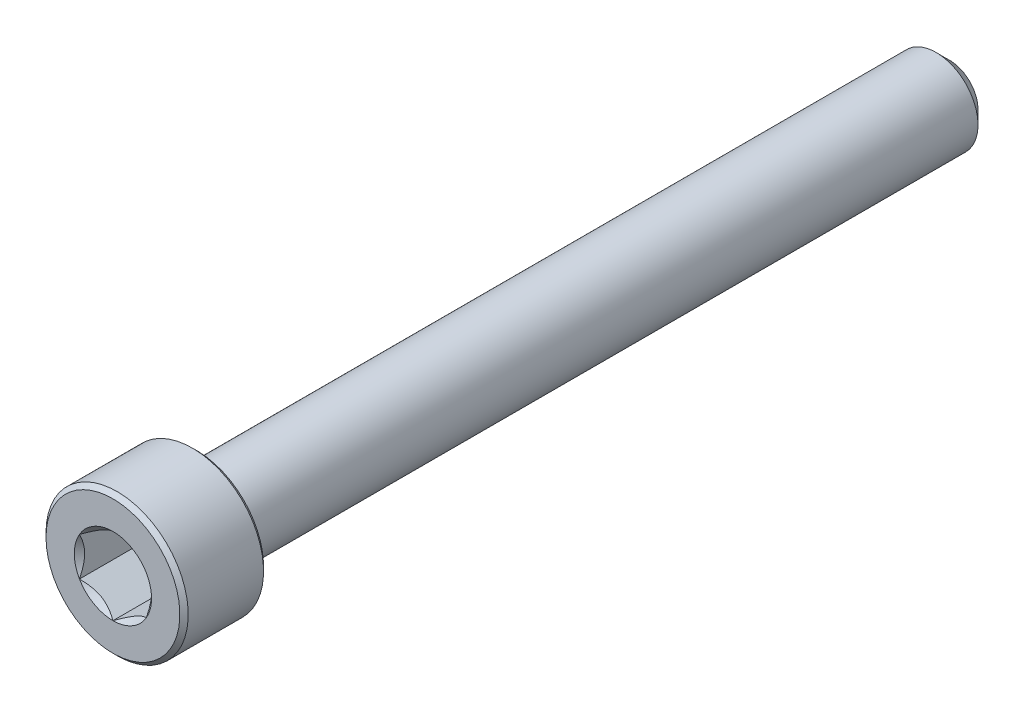
ISO-10303-21;
HEADER;
FILE_DESCRIPTION(('STEP AP214'),'2;1');
FILE_NAME('part.step','',(''),(''),'','','');
FILE_SCHEMA(('AUTOMOTIVE_DESIGN { 1 0 10303 214 1 1 1 1 }'));
ENDSEC;
DATA;
#1=APPLICATION_CONTEXT('core data for automotive mechanical design processes');
#2=APPLICATION_PROTOCOL_DEFINITION('international standard','automotive_design',2000,#1);
#3=PRODUCT_CONTEXT('',#1,'mechanical');
#4=PRODUCT('Part','Part','',(#3));
#5=PRODUCT_RELATED_PRODUCT_CATEGORY('part','',(#4));
#6=PRODUCT_DEFINITION_FORMATION('','',#4);
#7=PRODUCT_DEFINITION_CONTEXT('part definition',#1,'design');
#8=PRODUCT_DEFINITION('design','',#6,#7);
#9=PRODUCT_DEFINITION_SHAPE('','',#8);
#10=(LENGTH_UNIT() NAMED_UNIT(*) SI_UNIT(.MILLI.,.METRE.));
#11=(NAMED_UNIT(*) PLANE_ANGLE_UNIT() SI_UNIT($,.RADIAN.));
#12=(NAMED_UNIT(*) SI_UNIT($,.STERADIAN.) SOLID_ANGLE_UNIT());
#13=UNCERTAINTY_MEASURE_WITH_UNIT(LENGTH_MEASURE(1.E-05),#10,'distance_accuracy_value','');
#14=(GEOMETRIC_REPRESENTATION_CONTEXT(3) GLOBAL_UNCERTAINTY_ASSIGNED_CONTEXT((#13)) GLOBAL_UNIT_ASSIGNED_CONTEXT((#10,
#11,#12)) REPRESENTATION_CONTEXT('',''));
#15=CARTESIAN_POINT('',(0.,0.,0.));
#16=DIRECTION('',(0.,0.,1.));
#17=DIRECTION('',(1.,0.,0.));
#18=AXIS2_PLACEMENT_3D('',#15,#16,#17);
#19=CARTESIAN_POINT('',(0.,0.,25.));
#20=DIRECTION('',(0.,0.,1.));
#21=DIRECTION('',(1.,0.,0.));
#22=AXIS2_PLACEMENT_3D('',#19,#20,#21);
#23=PLANE('',#22);
#24=CARTESIAN_POINT('',(0.,0.,25.));
#25=DIRECTION('',(0.,0.,1.));
#26=DIRECTION('',(1.,0.,0.));
#27=AXIS2_PLACEMENT_3D('',#24,#25,#26);
#28=CIRCLE('',#27,2.3094010767585);
#29=CARTESIAN_POINT('',(2.,1.15470053837925,25.));
#30=VERTEX_POINT('',#29);
#31=CARTESIAN_POINT('',(0.,2.3094010767585,25.));
#32=VERTEX_POINT('',#31);
#33=EDGE_CURVE('E104',#30,#32,#28,.T.);
#34=ORIENTED_EDGE('',*,*,#33,.F.);
#35=CARTESIAN_POINT('',(2.,-1.15470053837925,25.));
#36=VERTEX_POINT('',#35);
#37=EDGE_CURVE('E95',#36,#30,#28,.T.);
#38=ORIENTED_EDGE('',*,*,#37,.F.);
#39=CARTESIAN_POINT('',(0.,-2.3094010767585,25.));
#40=VERTEX_POINT('',#39);
#41=EDGE_CURVE('E102',#40,#36,#28,.T.);
#42=ORIENTED_EDGE('',*,*,#41,.F.);
#43=CARTESIAN_POINT('',(-2.,-1.15470053837925,25.));
#44=VERTEX_POINT('',#43);
#45=EDGE_CURVE('E271',#44,#40,#28,.T.);
#46=ORIENTED_EDGE('',*,*,#45,.F.);
#47=CARTESIAN_POINT('',(-2.,1.15470053837925,25.));
#48=VERTEX_POINT('',#47);
#49=EDGE_CURVE('E131',#48,#44,#28,.T.);
#50=ORIENTED_EDGE('',*,*,#49,.F.);
#51=EDGE_CURVE('E126',#32,#48,#28,.T.);
#52=ORIENTED_EDGE('',*,*,#51,.F.);
#53=EDGE_LOOP('',(#34,#38,#42,#46,#50,#52));
#54=FACE_BOUND('',#53,.T.);
#55=CARTESIAN_POINT('',(0.,0.,25.));
#56=DIRECTION('',(0.,0.,-1.));
#57=DIRECTION('',(-1.,0.,0.));
#58=AXIS2_PLACEMENT_3D('',#55,#56,#57);
#59=CIRCLE('',#58,4.);
#60=CARTESIAN_POINT('',(-4.,0.,25.));
#61=VERTEX_POINT('',#60);
#62=EDGE_CURVE('E50',#61,#61,#59,.T.);
#63=ORIENTED_EDGE('',*,*,#62,.F.);
#64=EDGE_LOOP('',(#63));
#65=FACE_BOUND('',#64,.T.);
#66=ADVANCED_FACE('F37',(#54,#65),#23,.T.);
#67=CARTESIAN_POINT('',(0.,0.,24.75));
#68=DIRECTION('',(0.,0.,-1.));
#69=DIRECTION('',(-1.,0.,0.));
#70=AXIS2_PLACEMENT_3D('',#67,#68,#69);
#71=CONICAL_SURFACE('',#70,4.25,0.785398163397462);
#72=ORIENTED_EDGE('',*,*,#62,.T.);
#73=EDGE_LOOP('',(#72));
#74=FACE_BOUND('',#73,.T.);
#75=CARTESIAN_POINT('',(0.,0.,24.75));
#76=DIRECTION('',(0.,0.,-1.));
#77=DIRECTION('',(-1.,0.,0.));
#78=AXIS2_PLACEMENT_3D('',#75,#76,#77);
#79=CIRCLE('',#78,4.25);
#80=CARTESIAN_POINT('',(-4.25,0.,24.75));
#81=VERTEX_POINT('',#80);
#82=EDGE_CURVE('E217',#81,#81,#79,.T.);
#83=ORIENTED_EDGE('',*,*,#82,.F.);
#84=EDGE_LOOP('',(#83));
#85=FACE_BOUND('',#84,.T.);
#86=ADVANCED_FACE('F205',(#74,#85),#71,.T.);
#87=CARTESIAN_POINT('',(0.,0.,-25.));
#88=DIRECTION('',(0.,0.,-1.));
#89=DIRECTION('',(-1.,0.,0.));
#90=AXIS2_PLACEMENT_3D('',#87,#88,#89);
#91=CYLINDRICAL_SURFACE('',#90,4.25);
#92=ORIENTED_EDGE('',*,*,#82,.T.);
#93=EDGE_LOOP('',(#92));
#94=FACE_BOUND('',#93,.T.);
#95=CARTESIAN_POINT('',(0.,0.,20.25));
#96=DIRECTION('',(0.,0.,-1.));
#97=DIRECTION('',(-1.,0.,0.));
#98=AXIS2_PLACEMENT_3D('',#95,#96,#97);
#99=CIRCLE('',#98,4.25);
#100=CARTESIAN_POINT('',(-4.25,0.,20.25));
#101=VERTEX_POINT('',#100);
#102=EDGE_CURVE('E219',#101,#101,#99,.T.);
#103=ORIENTED_EDGE('',*,*,#102,.F.);
#104=EDGE_LOOP('',(#103));
#105=FACE_BOUND('',#104,.T.);
#106=ADVANCED_FACE('F202',(#94,#105),#91,.T.);
#107=CARTESIAN_POINT('',(0.,0.,20.));
#108=DIRECTION('',(0.,0.,1.));
#109=DIRECTION('',(1.,0.,0.));
#110=AXIS2_PLACEMENT_3D('',#107,#108,#109);
#111=CONICAL_SURFACE('',#110,4.,0.785398163397448);
#112=ORIENTED_EDGE('',*,*,#102,.T.);
#113=EDGE_LOOP('',(#112));
#114=FACE_BOUND('',#113,.T.);
#115=CARTESIAN_POINT('',(0.,0.,20.));
#116=DIRECTION('',(0.,0.,-1.));
#117=DIRECTION('',(-1.,0.,0.));
#118=AXIS2_PLACEMENT_3D('',#115,#116,#117);
#119=CIRCLE('',#118,4.);
#120=CARTESIAN_POINT('',(-4.,0.,20.));
#121=VERTEX_POINT('',#120);
#122=EDGE_CURVE('E225',#121,#121,#119,.T.);
#123=ORIENTED_EDGE('',*,*,#122,.F.);
#124=EDGE_LOOP('',(#123));
#125=FACE_BOUND('',#124,.T.);
#126=ADVANCED_FACE('F198',(#114,#125),#111,.T.);
#127=CARTESIAN_POINT('',(0.,4.,20.));
#128=DIRECTION('',(0.,0.,-1.));
#129=DIRECTION('',(-1.,0.,0.));
#130=AXIS2_PLACEMENT_3D('',#127,#128,#129);
#131=PLANE('',#130);
#132=ORIENTED_EDGE('',*,*,#122,.T.);
#133=EDGE_LOOP('',(#132));
#134=FACE_BOUND('',#133,.T.);
#135=CARTESIAN_POINT('',(0.,0.,20.));
#136=DIRECTION('',(0.,0.,-1.));
#137=DIRECTION('',(-1.,0.,0.));
#138=AXIS2_PLACEMENT_3D('',#135,#136,#137);
#139=CIRCLE('',#138,2.5);
#140=CARTESIAN_POINT('',(-2.5,0.,20.));
#141=VERTEX_POINT('',#140);
#142=EDGE_CURVE('E231',#141,#141,#139,.T.);
#143=ORIENTED_EDGE('',*,*,#142,.F.);
#144=EDGE_LOOP('',(#143));
#145=FACE_BOUND('',#144,.T.);
#146=ADVANCED_FACE('F194',(#134,#145),#131,.T.);
#147=CARTESIAN_POINT('',(0.,0.,-25.));
#148=DIRECTION('',(0.,0.,-1.));
#149=DIRECTION('',(-1.,0.,0.));
#150=AXIS2_PLACEMENT_3D('',#147,#148,#149);
#151=CYLINDRICAL_SURFACE('',#150,2.5);
#152=ORIENTED_EDGE('',*,*,#142,.T.);
#153=EDGE_LOOP('',(#152));
#154=FACE_BOUND('',#153,.T.);
#155=CARTESIAN_POINT('',(0.,0.,-24.2));
#156=DIRECTION('',(0.,0.,-1.));
#157=DIRECTION('',(-1.,0.,0.));
#158=AXIS2_PLACEMENT_3D('',#155,#156,#157);
#159=CIRCLE('',#158,2.5);
#160=CARTESIAN_POINT('',(-2.5,0.,-24.2));
#161=VERTEX_POINT('',#160);
#162=EDGE_CURVE('E234',#161,#161,#159,.T.);
#163=ORIENTED_EDGE('',*,*,#162,.F.);
#164=EDGE_LOOP('',(#163));
#165=FACE_BOUND('',#164,.T.);
#166=ADVANCED_FACE('F190',(#154,#165),#151,.T.);
#167=CARTESIAN_POINT('',(0.,0.,-25.));
#168=DIRECTION('',(0.,0.,1.));
#169=DIRECTION('',(1.,0.,0.));
#170=AXIS2_PLACEMENT_3D('',#167,#168,#169);
#171=CONICAL_SURFACE('',#170,1.7,0.78539816339744);
#172=ORIENTED_EDGE('',*,*,#162,.T.);
#173=EDGE_LOOP('',(#172));
#174=FACE_BOUND('',#173,.T.);
#175=CARTESIAN_POINT('',(0.,0.,-25.));
#176=DIRECTION('',(0.,0.,-1.));
#177=DIRECTION('',(-1.,0.,0.));
#178=AXIS2_PLACEMENT_3D('',#175,#176,#177);
#179=CIRCLE('',#178,1.7);
#180=CARTESIAN_POINT('',(-1.7,0.,-25.));
#181=VERTEX_POINT('',#180);
#182=EDGE_CURVE('E238',#181,#181,#179,.T.);
#183=ORIENTED_EDGE('',*,*,#182,.F.);
#184=EDGE_LOOP('',(#183));
#185=FACE_BOUND('',#184,.T.);
#186=ADVANCED_FACE('F186',(#174,#185),#171,.T.);
#187=CARTESIAN_POINT('',(0.,1.7,-25.));
#188=DIRECTION('',(0.,0.,-1.));
#189=DIRECTION('',(-1.,0.,0.));
#190=AXIS2_PLACEMENT_3D('',#187,#188,#189);
#191=PLANE('',#190);
#192=ORIENTED_EDGE('',*,*,#182,.T.);
#193=EDGE_LOOP('',(#192));
#194=FACE_BOUND('',#193,.T.);
#195=ADVANCED_FACE('F183',(#194),#191,.T.);
#196=CARTESIAN_POINT('',(0.,0.,25.));
#197=DIRECTION('',(0.,0.,1.));
#198=DIRECTION('',(1.,0.,0.));
#199=AXIS2_PLACEMENT_3D('',#196,#197,#198);
#200=CONICAL_SURFACE('',#199,2.3094010767585,0.78539816339745);
#201=ORIENTED_EDGE('',*,*,#41,.T.);
#202=CARTESIAN_POINT('',(-0.000199999999997986,-2.30951654681234,25.0001154787137));
#203=CARTESIAN_POINT('',(0.0685530340307071,-2.26982196410711,24.9604530902256));
#204=CARTESIAN_POINT('',(0.138455742135513,-2.22946361676572,24.9231199822842));
#205=CARTESIAN_POINT('',(0.280995244550438,-2.1471683966763,24.8547636851361));
#206=CARTESIAN_POINT('',(0.35364559756536,-2.10522369580642,24.8237785337372));
#207=CARTESIAN_POINT('',(0.500141601053972,-2.02064418875706,24.7707002165441));
#208=CARTESIAN_POINT('',(0.573949935246295,-1.97803092714269,24.7484736271766));
#209=CARTESIAN_POINT('',(0.723191631835264,-1.89186619344273,24.7142288166751));
#210=CARTESIAN_POINT('',(0.798620433918152,-1.84831735425552,24.7021850291441));
#211=CARTESIAN_POINT('',(0.928615500671079,-1.7732646674724,24.6913185119056));
#212=CARTESIAN_POINT('',(0.983013783970108,-1.74185780396625,24.68970975361));
#213=CARTESIAN_POINT('',(1.09172145551969,-1.67909540053412,24.6924188775987));
#214=CARTESIAN_POINT('',(1.14603080592134,-1.64773988246022,24.696738837758));
#215=CARTESIAN_POINT('',(1.25413672758934,-1.5853248994842,24.7110595674099));
#216=CARTESIAN_POINT('',(1.30793265655479,-1.55426580541469,24.721066692762));
#217=CARTESIAN_POINT('',(1.41459426230557,-1.49268469862228,24.7462124302497));
#218=CARTESIAN_POINT('',(1.46746001007071,-1.46216264491917,24.7613506490422));
#219=CARTESIAN_POINT('',(1.60287973308984,-1.38397803138049,24.8062945034292));
#220=CARTESIAN_POINT('',(1.68459383484948,-1.33680037273297,24.8394888394258));
#221=CARTESIAN_POINT('',(1.8047470372578,-1.26742988897853,24.8955258231714));
#222=CARTESIAN_POINT('',(1.84434285210918,-1.24456923461531,24.9152147029469));
#223=CARTESIAN_POINT('',(1.92280095888787,-1.19927142554652,24.9563873183649));
#224=CARTESIAN_POINT('',(1.96166368359374,-1.17683402097614,24.9778699516512));
#225=CARTESIAN_POINT('',(2.0002,-1.15458506832541,25.0001154787137));
#226=B_SPLINE_CURVE_WITH_KNOTS('',3,(#202,#203,#204,#205,#206,#207,#208,#209,#210,#211,#212,
#213,#214,#215,#216,#217,#218,#219,#220,#221,#222,#223,#224,#225),.UNSPECIFIED.,.F.,.F.,(4,2,2,
2,2,2,2,2,2,2,2,4),(0.,0.266420613771063,0.534393751523387,0.798110374376911,1.06116288956936,
1.24939906803721,1.43770123566247,1.62621426093931,1.81471283831913,2.11415604834144,
2.2634717071779,2.4126962696977),.UNSPECIFIED.);
#227=EDGE_CURVE('E12',#40,#36,#226,.T.);
#228=ORIENTED_EDGE('',*,*,#227,.F.);
#229=EDGE_LOOP('',(#201,#228));
#230=FACE_BOUND('',#229,.T.);
#231=ADVANCED_FACE('F149',(#230),#200,.F.);
#232=ORIENTED_EDGE('',*,*,#45,.T.);
#233=CARTESIAN_POINT('',(-2.0002,-1.15458506832541,25.0001154787137));
#234=CARTESIAN_POINT('',(-1.93144696596929,-1.19427965103064,24.9604530902256));
#235=CARTESIAN_POINT('',(-1.86154425786449,-1.23463799837204,24.9231199822842));
#236=CARTESIAN_POINT('',(-1.71900475544956,-1.31693321846145,24.8547636851361));
#237=CARTESIAN_POINT('',(-1.64635440243464,-1.35887791933134,24.8237785337372));
#238=CARTESIAN_POINT('',(-1.49985839894603,-1.44345742638069,24.7707002165441));
#239=CARTESIAN_POINT('',(-1.42605006475371,-1.48607068799507,24.7484736271766));
#240=CARTESIAN_POINT('',(-1.27680836816474,-1.57223542169503,24.7142288166751));
#241=CARTESIAN_POINT('',(-1.20137956608185,-1.61578426088223,24.7021850291441));
#242=CARTESIAN_POINT('',(-1.07138449932892,-1.69083694766536,24.6913185119056));
#243=CARTESIAN_POINT('',(-1.01698621602989,-1.72224381117151,24.68970975361));
#244=CARTESIAN_POINT('',(-0.908278544480307,-1.78500621460364,24.6924188775987));
#245=CARTESIAN_POINT('',(-0.853969194078661,-1.81636173267754,24.696738837758));
#246=CARTESIAN_POINT('',(-0.745863272410662,-1.87877671565355,24.7110595674099));
#247=CARTESIAN_POINT('',(-0.692067343445208,-1.90983580972306,24.721066692762));
#248=CARTESIAN_POINT('',(-0.585405737694427,-1.97141691651547,24.7462124302497));
#249=CARTESIAN_POINT('',(-0.532539989929288,-2.00193897021859,24.7613506490422));
#250=CARTESIAN_POINT('',(-0.397120266910156,-2.08012358375727,24.8062945034292));
#251=CARTESIAN_POINT('',(-0.315406165150521,-2.12730124240478,24.8394888394258));
#252=CARTESIAN_POINT('',(-0.195252962742198,-2.19667172615922,24.8955258231714));
#253=CARTESIAN_POINT('',(-0.155657147890823,-2.21953238052245,24.9152147029469));
#254=CARTESIAN_POINT('',(-0.0771990411121283,-2.26483018959123,24.9563873183649));
#255=CARTESIAN_POINT('',(-0.0383363164062601,-2.28726759416161,24.9778699516512));
#256=CARTESIAN_POINT('',(0.000200000000000165,-2.30951654681234,25.0001154787137));
#257=B_SPLINE_CURVE_WITH_KNOTS('',3,(#233,#234,#235,#236,#237,#238,#239,#240,#241,#242,#243,
#244,#245,#246,#247,#248,#249,#250,#251,#252,#253,#254,#255,#256),.UNSPECIFIED.,.F.,.F.,(4,2,2,
2,2,2,2,2,2,2,2,4),(0.,0.266420613771063,0.534393751523387,0.798110374376913,1.06116288956936,
1.24939906803721,1.43770123566247,1.62621426093931,1.81471283831913,2.11415604834145,
2.2634717071779,2.41269626969771),.UNSPECIFIED.);
#258=EDGE_CURVE('E127',#44,#40,#257,.T.);
#259=ORIENTED_EDGE('',*,*,#258,.F.);
#260=EDGE_LOOP('',(#232,#259));
#261=FACE_BOUND('',#260,.T.);
#262=ADVANCED_FACE('F279',(#261),#200,.F.);
#263=ORIENTED_EDGE('',*,*,#49,.T.);
#264=CARTESIAN_POINT('',(-2.,-2.30294417292923,25.7407713550277));
#265=CARTESIAN_POINT('',(-2.,-2.24687002663712,25.698443273626));
#266=CARTESIAN_POINT('',(-2.,-2.19048190536959,25.6565251568643));
#267=CARTESIAN_POINT('',(-2.,-2.07695390496424,25.573690417861));
#268=CARTESIAN_POINT('',(-2.,-2.01981384066454,25.5327740496681));
#269=CARTESIAN_POINT('',(-2.,-1.90424016804776,25.4518334520186));
#270=CARTESIAN_POINT('',(-2.,-1.8457999674391,25.4118185915599));
#271=CARTESIAN_POINT('',(-2.,-1.7279274546176,25.3332889936643));
#272=CARTESIAN_POINT('',(-2.,-1.66849521292324,25.2947741502431));
#273=CARTESIAN_POINT('',(-2.,-1.4816299571002,25.1776406516043));
#274=CARTESIAN_POINT('',(-2.,-1.35220318163536,25.1021459017296));
#275=CARTESIAN_POINT('',(-2.,-1.08689521592924,24.9640493509944));
#276=CARTESIAN_POINT('',(-2.,-0.951037763938192,24.9014040859035));
#277=CARTESIAN_POINT('',(-2.,-0.747111912259409,24.8247635438751));
#278=CARTESIAN_POINT('',(-2.,-0.682064034147876,24.8027671799191));
#279=CARTESIAN_POINT('',(-2.,-0.550398103294752,24.7639966876601));
#280=CARTESIAN_POINT('',(-2.,-0.483779942722476,24.7472229191212));
#281=CARTESIAN_POINT('',(-2.,-0.350484328847655,24.7200482578844));
#282=CARTESIAN_POINT('',(-2.,-0.283829489364786,24.7095381767417));
#283=CARTESIAN_POINT('',(-2.,-0.149806987139377,24.6950960855449));
#284=CARTESIAN_POINT('',(-2.,-0.0824394489341225,24.6911629447331));
#285=CARTESIAN_POINT('',(-2.,0.0499055622944887,24.6901664769337));
#286=CARTESIAN_POINT('',(-2.,0.114881285143171,24.6928596448504));
#287=CARTESIAN_POINT('',(-2.,0.244275921482759,24.7044300704227));
#288=CARTESIAN_POINT('',(-2.,0.308694780266752,24.7133079288332));
#289=CARTESIAN_POINT('',(-2.,0.437599788610703,24.7369136592961));
#290=CARTESIAN_POINT('',(-2.,0.502067428644594,24.7517410834465));
#291=CARTESIAN_POINT('',(-2.,0.629594322598305,24.786457883628));
#292=CARTESIAN_POINT('',(-2.,0.69265369388315,24.8063468361063));
#293=CARTESIAN_POINT('',(-2.,0.891187889210544,24.8764469792562));
#294=CARTESIAN_POINT('',(-2.,1.02383545707306,24.9346418003215));
#295=CARTESIAN_POINT('',(-2.,1.28290932150074,25.0640305754596));
#296=CARTESIAN_POINT('',(-2.,1.4093111258757,25.1352712314148));
#297=CARTESIAN_POINT('',(-2.,1.59200441438963,25.2464419918747));
#298=CARTESIAN_POINT('',(-2.,1.65027549026191,25.2831821903374));
#299=CARTESIAN_POINT('',(-2.,1.76581760389242,25.3582145141838));
#300=CARTESIAN_POINT('',(-2.,1.82308856543104,25.396506757118));
#301=CARTESIAN_POINT('',(-2.,1.93629654762084,25.4740422640812));
#302=CARTESIAN_POINT('',(-2.,1.99224062500538,25.5132752761336));
#303=CARTESIAN_POINT('',(-2.,2.10336424029899,25.5927788307365));
#304=CARTESIAN_POINT('',(-2.,2.15854398422468,25.6330490850006));
#305=CARTESIAN_POINT('',(-2.,2.21340370692658,25.6737442381459));
#306=B_SPLINE_CURVE_WITH_KNOTS('',3,(#264,#265,#266,#267,#268,#269,#270,#271,#272,#273,#274,
#275,#276,#277,#278,#279,#280,#281,#282,#283,#284,#285,#286,#287,#288,#289,#290,#291,#292,#293,
#294,#295,#296,#297,#298,#299,#300,#301,#302,#303,#304,#305),.UNSPECIFIED.,.F.,.F.,(4,2,2,2,2,2,
2,2,2,2,2,2,2,2,2,2,2,2,2,2,4),(0.,0.21077273197689,0.421598374658589,0.63405755462349,
0.846501695870171,1.29562155455624,1.74319622821645,1.94902062110207,2.15485918928325,
2.35699582502635,2.5590977043214,2.75388435553556,2.94868993014815,3.14690093452585,
3.34509535789702,3.77838155837654,4.21325029921625,4.41989056685646,4.62654651460921,
4.83152377111289,5.03644465914085),.UNSPECIFIED.);
#307=EDGE_CURVE('E129',#48,#44,#306,.F.);
#308=ORIENTED_EDGE('',*,*,#307,.F.);
#309=EDGE_LOOP('',(#263,#308));
#310=FACE_BOUND('',#309,.T.);
#311=ADVANCED_FACE('F276',(#310),#200,.F.);
#312=ORIENTED_EDGE('',*,*,#51,.T.);
#313=CARTESIAN_POINT('',(0.000199999999999413,2.30951654681234,25.0001154787137));
#314=CARTESIAN_POINT('',(-0.0685530340307058,2.26982196410711,24.9604530902256));
#315=CARTESIAN_POINT('',(-0.138455742135512,2.22946361676572,24.9231199822842));
#316=CARTESIAN_POINT('',(-0.280995244550438,2.1471683966763,24.8547636851361));
#317=CARTESIAN_POINT('',(-0.35364559756536,2.10522369580642,24.8237785337372));
#318=CARTESIAN_POINT('',(-0.500141601053973,2.02064418875706,24.7707002165441));
#319=CARTESIAN_POINT('',(-0.573949935246296,1.97803092714269,24.7484736271766));
#320=CARTESIAN_POINT('',(-0.723191631835266,1.89186619344273,24.7142288166751));
#321=CARTESIAN_POINT('',(-0.798620433918154,1.84831735425552,24.7021850291441));
#322=CARTESIAN_POINT('',(-0.928615500671081,1.77326466747239,24.6913185119056));
#323=CARTESIAN_POINT('',(-0.98301378397011,1.74185780396625,24.68970975361));
#324=CARTESIAN_POINT('',(-1.0917214555197,1.67909540053412,24.6924188775987));
#325=CARTESIAN_POINT('',(-1.14603080592134,1.64773988246021,24.696738837758));
#326=CARTESIAN_POINT('',(-1.25413672758934,1.5853248994842,24.7110595674099));
#327=CARTESIAN_POINT('',(-1.30793265655479,1.55426580541469,24.721066692762));
#328=CARTESIAN_POINT('',(-1.41459426230558,1.49268469862228,24.7462124302497));
#329=CARTESIAN_POINT('',(-1.46746001007071,1.46216264491916,24.7613506490422));
#330=CARTESIAN_POINT('',(-1.60287973308985,1.38397803138048,24.8062945034292));
#331=CARTESIAN_POINT('',(-1.68459383484948,1.33680037273297,24.8394888394258));
#332=CARTESIAN_POINT('',(-1.8047470372578,1.26742988897853,24.8955258231714));
#333=CARTESIAN_POINT('',(-1.84434285210918,1.24456923461531,24.9152147029469));
#334=CARTESIAN_POINT('',(-1.92280095888787,1.19927142554652,24.9563873183649));
#335=CARTESIAN_POINT('',(-1.96166368359374,1.17683402097614,24.9778699516512));
#336=CARTESIAN_POINT('',(-2.0002,1.15458506832541,25.0001154787137));
#337=B_SPLINE_CURVE_WITH_KNOTS('',3,(#313,#314,#315,#316,#317,#318,#319,#320,#321,#322,#323,
#324,#325,#326,#327,#328,#329,#330,#331,#332,#333,#334,#335,#336),.UNSPECIFIED.,.F.,.F.,(4,2,2,
2,2,2,2,2,2,2,2,4),(0.,0.266420613771063,0.534393751523389,0.798110374376915,1.06116288956936,
1.24939906803722,1.43770123566247,1.62621426093932,1.81471283831913,2.11415604834145,
2.2634717071779,2.41269626969771),.UNSPECIFIED.);
#338=EDGE_CURVE('E114',#32,#48,#337,.T.);
#339=ORIENTED_EDGE('',*,*,#338,.F.);
#340=EDGE_LOOP('',(#312,#339));
#341=FACE_BOUND('',#340,.T.);
#342=ADVANCED_FACE('F308',(#341),#200,.F.);
#343=ORIENTED_EDGE('',*,*,#33,.T.);
#344=CARTESIAN_POINT('',(2.0002,1.15458506832541,25.0001154787137));
#345=CARTESIAN_POINT('',(1.9314469659693,1.19427965103064,24.9604530902256));
#346=CARTESIAN_POINT('',(1.86154425786449,1.23463799837204,24.9231199822842));
#347=CARTESIAN_POINT('',(1.71900475544956,1.31693321846145,24.8547636851361));
#348=CARTESIAN_POINT('',(1.64635440243464,1.35887791933134,24.8237785337372));
#349=CARTESIAN_POINT('',(1.49985839894603,1.44345742638069,24.7707002165441));
#350=CARTESIAN_POINT('',(1.4260500647537,1.48607068799507,24.7484736271766));
#351=CARTESIAN_POINT('',(1.27680836816473,1.57223542169503,24.7142288166751));
#352=CARTESIAN_POINT('',(1.20137956608184,1.61578426088223,24.7021850291441));
#353=CARTESIAN_POINT('',(1.07138449932892,1.69083694766536,24.6913185119056));
#354=CARTESIAN_POINT('',(1.01698621602989,1.72224381117151,24.68970975361));
#355=CARTESIAN_POINT('',(0.908278544480303,1.78500621460364,24.6924188775987));
#356=CARTESIAN_POINT('',(0.853969194078657,1.81636173267754,24.696738837758));
#357=CARTESIAN_POINT('',(0.745863272410659,1.87877671565355,24.7110595674099));
#358=CARTESIAN_POINT('',(0.692067343445205,1.90983580972306,24.721066692762));
#359=CARTESIAN_POINT('',(0.585405737694424,1.97141691651548,24.7462124302497));
#360=CARTESIAN_POINT('',(0.532539989929284,2.00193897021859,24.7613506490422));
#361=CARTESIAN_POINT('',(0.397120266910153,2.08012358375727,24.8062945034292));
#362=CARTESIAN_POINT('',(0.315406165150519,2.12730124240478,24.8394888394258));
#363=CARTESIAN_POINT('',(0.195252962742196,2.19667172615922,24.8955258231714));
#364=CARTESIAN_POINT('',(0.155657147890822,2.21953238052245,24.9152147029469));
#365=CARTESIAN_POINT('',(0.0771990411121275,2.26483018959124,24.9563873183649));
#366=CARTESIAN_POINT('',(0.0383363164062596,2.28726759416161,24.9778699516512));
#367=CARTESIAN_POINT('',(-0.000200000000000325,2.30951654681234,25.0001154787137));
#368=B_SPLINE_CURVE_WITH_KNOTS('',3,(#344,#345,#346,#347,#348,#349,#350,#351,#352,#353,#354,
#355,#356,#357,#358,#359,#360,#361,#362,#363,#364,#365,#366,#367),.UNSPECIFIED.,.F.,.F.,(4,2,2,
2,2,2,2,2,2,2,2,4),(0.,0.266420613771065,0.534393751523391,0.798110374376919,1.06116288956937,
1.24939906803722,1.43770123566248,1.62621426093932,1.81471283831914,2.11415604834145,
2.26347170717791,2.41269626969771),.UNSPECIFIED.);
#369=EDGE_CURVE('E107',#30,#32,#368,.T.);
#370=ORIENTED_EDGE('',*,*,#369,.F.);
#371=EDGE_LOOP('',(#343,#370));
#372=FACE_BOUND('',#371,.T.);
#373=ADVANCED_FACE('F108',(#372),#200,.F.);
#374=ORIENTED_EDGE('',*,*,#37,.T.);
#375=CARTESIAN_POINT('',(2.,-2.30294417292923,25.7407713550277));
#376=CARTESIAN_POINT('',(2.,-2.24687002663712,25.698443273626));
#377=CARTESIAN_POINT('',(2.,-2.19048190536959,25.6565251568643));
#378=CARTESIAN_POINT('',(2.,-2.07695390496424,25.573690417861));
#379=CARTESIAN_POINT('',(2.,-2.01981384066454,25.5327740496681));
#380=CARTESIAN_POINT('',(2.,-1.90424016804776,25.4518334520186));
#381=CARTESIAN_POINT('',(2.,-1.8457999674391,25.4118185915599));
#382=CARTESIAN_POINT('',(2.,-1.7279274546176,25.3332889936643));
#383=CARTESIAN_POINT('',(2.,-1.66849521292324,25.2947741502431));
#384=CARTESIAN_POINT('',(2.,-1.4816299571002,25.1776406516043));
#385=CARTESIAN_POINT('',(2.,-1.35220318163536,25.1021459017296));
#386=CARTESIAN_POINT('',(2.,-1.08689521592925,24.9640493509944));
#387=CARTESIAN_POINT('',(2.,-0.951037763938192,24.9014040859035));
#388=CARTESIAN_POINT('',(2.,-0.747111912259408,24.8247635438751));
#389=CARTESIAN_POINT('',(2.,-0.682064034147875,24.8027671799191));
#390=CARTESIAN_POINT('',(2.,-0.550398103294752,24.7639966876601));
#391=CARTESIAN_POINT('',(2.,-0.483779942722476,24.7472229191212));
#392=CARTESIAN_POINT('',(2.,-0.350484328847655,24.7200482578844));
#393=CARTESIAN_POINT('',(2.,-0.283829489364786,24.7095381767417));
#394=CARTESIAN_POINT('',(2.,-0.149806987139378,24.6950960855449));
#395=CARTESIAN_POINT('',(2.,-0.0824394489341232,24.6911629447331));
#396=CARTESIAN_POINT('',(2.,0.0499055622944886,24.6901664769337));
#397=CARTESIAN_POINT('',(2.,0.114881285143171,24.6928596448504));
#398=CARTESIAN_POINT('',(2.,0.24427592148276,24.7044300704227));
#399=CARTESIAN_POINT('',(2.,0.308694780266752,24.7133079288332));
#400=CARTESIAN_POINT('',(2.,0.437599788610704,24.7369136592961));
#401=CARTESIAN_POINT('',(2.,0.502067428644594,24.7517410834465));
#402=CARTESIAN_POINT('',(2.,0.629594322598305,24.786457883628));
#403=CARTESIAN_POINT('',(2.,0.692653693883149,24.8063468361063));
#404=CARTESIAN_POINT('',(2.,0.891187889210544,24.8764469792562));
#405=CARTESIAN_POINT('',(2.,1.02383545707306,24.9346418003215));
#406=CARTESIAN_POINT('',(2.,1.28290932150074,25.0640305754596));
#407=CARTESIAN_POINT('',(2.,1.4093111258757,25.1352712314148));
#408=CARTESIAN_POINT('',(2.,1.59200441438963,25.2464419918747));
#409=CARTESIAN_POINT('',(2.,1.65027549026191,25.2831821903374));
#410=CARTESIAN_POINT('',(2.,1.76581760389242,25.3582145141838));
#411=CARTESIAN_POINT('',(2.,1.82308856543104,25.396506757118));
#412=CARTESIAN_POINT('',(2.,1.93629654762084,25.4740422640812));
#413=CARTESIAN_POINT('',(2.,1.99224062500538,25.5132752761336));
#414=CARTESIAN_POINT('',(2.,2.103364240299,25.5927788307365));
#415=CARTESIAN_POINT('',(2.,2.15854398422468,25.6330490850006));
#416=CARTESIAN_POINT('',(2.,2.21340370692658,25.6737442381459));
#417=B_SPLINE_CURVE_WITH_KNOTS('',3,(#375,#376,#377,#378,#379,#380,#381,#382,#383,#384,#385,
#386,#387,#388,#389,#390,#391,#392,#393,#394,#395,#396,#397,#398,#399,#400,#401,#402,#403,#404,
#405,#406,#407,#408,#409,#410,#411,#412,#413,#414,#415,#416),.UNSPECIFIED.,.F.,.F.,(4,2,2,2,2,2,
2,2,2,2,2,2,2,2,2,2,2,2,2,2,4),(0.,0.210772731976891,0.421598374658588,0.634057554623487,
0.846501695870171,1.29562155455624,1.74319622821645,1.94902062110208,2.15485918928326,
2.35699582502635,2.5590977043214,2.75388435553556,2.94868993014815,3.14690093452586,
3.34509535789702,3.77838155837654,4.21325029921625,4.41989056685646,4.62654651460921,
4.83152377111289,5.03644465914085),.UNSPECIFIED.);
#418=EDGE_CURVE('E98',#36,#30,#417,.T.);
#419=ORIENTED_EDGE('',*,*,#418,.F.);
#420=EDGE_LOOP('',(#374,#419));
#421=FACE_BOUND('',#420,.T.);
#422=ADVANCED_FACE('F97',(#421),#200,.F.);
#423=CARTESIAN_POINT('',(0.,4.,21.));
#424=DIRECTION('',(0.,0.,-1.));
#425=DIRECTION('',(-1.,0.,0.));
#426=AXIS2_PLACEMENT_3D('',#423,#424,#425);
#427=PLANE('',#426);
#428=DIRECTION('',(0.866025403784439,0.5,0.));
#429=VECTOR('',#428,1.);
#430=CARTESIAN_POINT('',(0.,-2.3094010767585,21.));
#431=LINE('',#430,#429);
#432=CARTESIAN_POINT('',(0.,-2.3094010767585,21.));
#433=VERTEX_POINT('',#432);
#434=CARTESIAN_POINT('',(2.,-1.15470053837925,21.));
#435=VERTEX_POINT('',#434);
#436=EDGE_CURVE('E242',#433,#435,#431,.T.);
#437=ORIENTED_EDGE('',*,*,#436,.T.);
#438=DIRECTION('',(0.,1.,0.));
#439=VECTOR('',#438,1.);
#440=CARTESIAN_POINT('',(2.,-1.15470053837925,21.));
#441=LINE('',#440,#439);
#442=CARTESIAN_POINT('',(2.,1.15470053837925,21.));
#443=VERTEX_POINT('',#442);
#444=EDGE_CURVE('E61',#435,#443,#441,.T.);
#445=ORIENTED_EDGE('',*,*,#444,.T.);
#446=DIRECTION('',(-0.866025403784439,0.5,0.));
#447=VECTOR('',#446,1.);
#448=CARTESIAN_POINT('',(2.,1.15470053837925,21.));
#449=LINE('',#448,#447);
#450=CARTESIAN_POINT('',(0.,2.3094010767585,21.));
#451=VERTEX_POINT('',#450);
#452=EDGE_CURVE('E121',#443,#451,#449,.T.);
#453=ORIENTED_EDGE('',*,*,#452,.T.);
#454=DIRECTION('',(-0.866025403784439,-0.5,0.));
#455=VECTOR('',#454,1.);
#456=CARTESIAN_POINT('',(0.,2.3094010767585,21.));
#457=LINE('',#456,#455);
#458=CARTESIAN_POINT('',(-2.,1.15470053837925,21.));
#459=VERTEX_POINT('',#458);
#460=EDGE_CURVE('E246',#451,#459,#457,.T.);
#461=ORIENTED_EDGE('',*,*,#460,.T.);
#462=DIRECTION('',(0.,-1.,0.));
#463=VECTOR('',#462,1.);
#464=CARTESIAN_POINT('',(-2.,1.15470053837925,21.));
#465=LINE('',#464,#463);
#466=CARTESIAN_POINT('',(-2.,-1.15470053837925,21.));
#467=VERTEX_POINT('',#466);
#468=EDGE_CURVE('E250',#459,#467,#465,.T.);
#469=ORIENTED_EDGE('',*,*,#468,.T.);
#470=DIRECTION('',(0.866025403784439,-0.5,0.));
#471=VECTOR('',#470,1.);
#472=CARTESIAN_POINT('',(-2.,-1.15470053837925,21.));
#473=LINE('',#472,#471);
#474=EDGE_CURVE('E254',#467,#433,#473,.T.);
#475=ORIENTED_EDGE('',*,*,#474,.T.);
#476=EDGE_LOOP('',(#437,#445,#453,#461,#469,#475));
#477=FACE_BOUND('',#476,.T.);
#478=ADVANCED_FACE('F148',(#477),#427,.F.);
#479=CARTESIAN_POINT('',(0.,-2.3094010767585,13.8898990733922));
#480=DIRECTION('',(0.5,-0.866025403784438,0.));
#481=DIRECTION('',(0.866025403784439,0.5,0.));
#482=AXIS2_PLACEMENT_3D('',#479,#480,#481);
#483=PLANE('',#482);
#484=DIRECTION('',(0.,0.,1.));
#485=VECTOR('',#484,1.);
#486=CARTESIAN_POINT('',(0.,-2.3094010767585,13.8898990733922));
#487=LINE('',#486,#485);
#488=EDGE_CURVE('E255',#433,#40,#487,.T.);
#489=ORIENTED_EDGE('',*,*,#488,.T.);
#490=ORIENTED_EDGE('',*,*,#227,.T.);
#491=DIRECTION('',(0.,0.,1.));
#492=VECTOR('',#491,1.);
#493=CARTESIAN_POINT('',(2.,-1.15470053837925,13.8898990733922));
#494=LINE('',#493,#492);
#495=EDGE_CURVE('E57',#435,#36,#494,.T.);
#496=ORIENTED_EDGE('',*,*,#495,.F.);
#497=ORIENTED_EDGE('',*,*,#436,.F.);
#498=EDGE_LOOP('',(#489,#490,#496,#497));
#499=FACE_BOUND('',#498,.T.);
#500=ADVANCED_FACE('F150',(#499),#483,.F.);
#501=CARTESIAN_POINT('',(-2.,-1.15470053837925,13.8898990733922));
#502=DIRECTION('',(-0.5,-0.866025403784439,0.));
#503=DIRECTION('',(0.866025403784439,-0.5,0.));
#504=AXIS2_PLACEMENT_3D('',#501,#502,#503);
#505=PLANE('',#504);
#506=DIRECTION('',(0.,0.,1.));
#507=VECTOR('',#506,1.);
#508=CARTESIAN_POINT('',(-2.,-1.15470053837925,13.8898990733922));
#509=LINE('',#508,#507);
#510=EDGE_CURVE('E251',#467,#44,#509,.T.);
#511=ORIENTED_EDGE('',*,*,#510,.T.);
#512=ORIENTED_EDGE('',*,*,#258,.T.);
#513=ORIENTED_EDGE('',*,*,#488,.F.);
#514=ORIENTED_EDGE('',*,*,#474,.F.);
#515=EDGE_LOOP('',(#511,#512,#513,#514));
#516=FACE_BOUND('',#515,.T.);
#517=ADVANCED_FACE('F144',(#516),#505,.F.);
#518=CARTESIAN_POINT('',(-2.,1.15470053837925,13.8898990733922));
#519=DIRECTION('',(-1.,0.,0.));
#520=DIRECTION('',(0.,-1.,0.));
#521=AXIS2_PLACEMENT_3D('',#518,#519,#520);
#522=PLANE('',#521);
#523=DIRECTION('',(0.,0.,1.));
#524=VECTOR('',#523,1.);
#525=CARTESIAN_POINT('',(-2.,1.15470053837925,13.8898990733922));
#526=LINE('',#525,#524);
#527=EDGE_CURVE('E247',#459,#48,#526,.T.);
#528=ORIENTED_EDGE('',*,*,#527,.T.);
#529=ORIENTED_EDGE('',*,*,#307,.T.);
#530=ORIENTED_EDGE('',*,*,#510,.F.);
#531=ORIENTED_EDGE('',*,*,#468,.F.);
#532=EDGE_LOOP('',(#528,#529,#530,#531));
#533=FACE_BOUND('',#532,.T.);
#534=ADVANCED_FACE('F283',(#533),#522,.F.);
#535=CARTESIAN_POINT('',(0.,2.3094010767585,13.8898990733922));
#536=DIRECTION('',(-0.5,0.866025403784438,0.));
#537=DIRECTION('',(-0.866025403784439,-0.5,0.));
#538=AXIS2_PLACEMENT_3D('',#535,#536,#537);
#539=PLANE('',#538);
#540=DIRECTION('',(0.,0.,1.));
#541=VECTOR('',#540,1.);
#542=CARTESIAN_POINT('',(0.,2.3094010767585,13.8898990733922));
#543=LINE('',#542,#541);
#544=EDGE_CURVE('E244',#451,#32,#543,.T.);
#545=ORIENTED_EDGE('',*,*,#544,.T.);
#546=ORIENTED_EDGE('',*,*,#338,.T.);
#547=ORIENTED_EDGE('',*,*,#527,.F.);
#548=ORIENTED_EDGE('',*,*,#460,.F.);
#549=EDGE_LOOP('',(#545,#546,#547,#548));
#550=FACE_BOUND('',#549,.T.);
#551=ADVANCED_FACE('F175',(#550),#539,.F.);
#552=CARTESIAN_POINT('',(2.,1.15470053837925,13.8898990733922));
#553=DIRECTION('',(0.5,0.866025403784439,0.));
#554=DIRECTION('',(-0.866025403784439,0.5,0.));
#555=AXIS2_PLACEMENT_3D('',#552,#553,#554);
#556=PLANE('',#555);
#557=DIRECTION('',(0.,0.,1.));
#558=VECTOR('',#557,1.);
#559=CARTESIAN_POINT('',(2.,1.15470053837925,13.8898990733922));
#560=LINE('',#559,#558);
#561=EDGE_CURVE('E117',#443,#30,#560,.T.);
#562=ORIENTED_EDGE('',*,*,#561,.T.);
#563=ORIENTED_EDGE('',*,*,#369,.T.);
#564=ORIENTED_EDGE('',*,*,#544,.F.);
#565=ORIENTED_EDGE('',*,*,#452,.F.);
#566=EDGE_LOOP('',(#562,#563,#564,#565));
#567=FACE_BOUND('',#566,.T.);
#568=ADVANCED_FACE('F119',(#567),#556,.F.);
#569=CARTESIAN_POINT('',(2.,-1.15470053837925,13.8898990733922));
#570=DIRECTION('',(1.,0.,0.));
#571=DIRECTION('',(0.,0.,-1.));
#572=AXIS2_PLACEMENT_3D('',#569,#570,#571);
#573=PLANE('',#572);
#574=ORIENTED_EDGE('',*,*,#495,.T.);
#575=ORIENTED_EDGE('',*,*,#418,.T.);
#576=ORIENTED_EDGE('',*,*,#561,.F.);
#577=ORIENTED_EDGE('',*,*,#444,.F.);
#578=EDGE_LOOP('',(#574,#575,#576,#577));
#579=FACE_BOUND('',#578,.T.);
#580=ADVANCED_FACE('F116',(#579),#573,.F.);
#581=CLOSED_SHELL('',(#66,#86,#106,#126,#146,#166,#186,#195,#231,#262,#311,#342,#373,#422,#478,
#500,#517,#534,#551,#568,#580));
#582=MANIFOLD_SOLID_BREP('B2',#581);
#583=ADVANCED_BREP_SHAPE_REPRESENTATION('',(#18,#582),#14);
#584=SHAPE_DEFINITION_REPRESENTATION(#9,#583);
ENDSEC;
END-ISO-10303-21;
